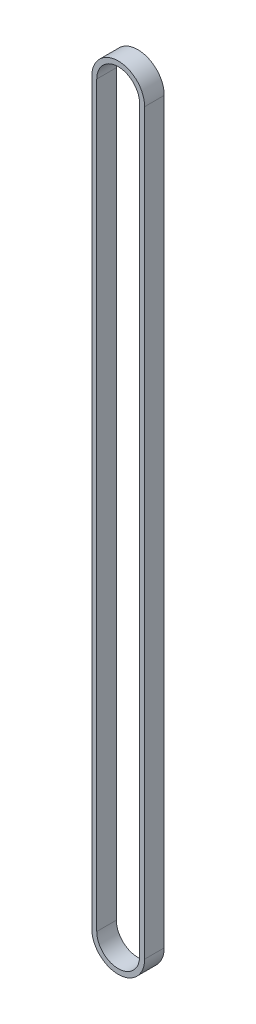
ISO-10303-21;
HEADER;
FILE_DESCRIPTION(('STEP AP214'),'2;1');
FILE_NAME('part.step','',(''),(''),'','','');
FILE_SCHEMA(('AUTOMOTIVE_DESIGN { 1 0 10303 214 1 1 1 1 }'));
ENDSEC;
DATA;
#1=APPLICATION_CONTEXT('core data for automotive mechanical design processes');
#2=APPLICATION_PROTOCOL_DEFINITION('international standard','automotive_design',2000,#1);
#3=PRODUCT_CONTEXT('',#1,'mechanical');
#4=PRODUCT('Part','Part','',(#3));
#5=PRODUCT_RELATED_PRODUCT_CATEGORY('part','',(#4));
#6=PRODUCT_DEFINITION_FORMATION('','',#4);
#7=PRODUCT_DEFINITION_CONTEXT('part definition',#1,'design');
#8=PRODUCT_DEFINITION('design','',#6,#7);
#9=PRODUCT_DEFINITION_SHAPE('','',#8);
#10=(LENGTH_UNIT() NAMED_UNIT(*) SI_UNIT(.MILLI.,.METRE.));
#11=(NAMED_UNIT(*) PLANE_ANGLE_UNIT() SI_UNIT($,.RADIAN.));
#12=(NAMED_UNIT(*) SI_UNIT($,.STERADIAN.) SOLID_ANGLE_UNIT());
#13=UNCERTAINTY_MEASURE_WITH_UNIT(LENGTH_MEASURE(1.E-05),#10,'distance_accuracy_value','');
#14=(GEOMETRIC_REPRESENTATION_CONTEXT(3) GLOBAL_UNCERTAINTY_ASSIGNED_CONTEXT((#13)) GLOBAL_UNIT_ASSIGNED_CONTEXT((#10,
#11,#12)) REPRESENTATION_CONTEXT('',''));
#15=CARTESIAN_POINT('',(0.,0.,0.));
#16=DIRECTION('',(0.,0.,1.));
#17=DIRECTION('',(1.,0.,0.));
#18=AXIS2_PLACEMENT_3D('',#15,#16,#17);
#19=CARTESIAN_POINT('',(-173.447800000006,0.,-228.050000000002));
#20=DIRECTION('',(1.,0.,0.));
#21=DIRECTION('',(0.,0.,-1.));
#22=AXIS2_PLACEMENT_3D('',#19,#20,#21);
#23=PLANE('',#22);
#24=DIRECTION('',(0.,1.,0.));
#25=VECTOR('',#24,1.);
#26=CARTESIAN_POINT('',(-173.447800000006,0.,-213.050000000002));
#27=LINE('',#26,#25);
#28=CARTESIAN_POINT('',(-173.447800000006,78.3000000000061,-213.050000000002));
#29=VERTEX_POINT('',#28);
#30=CARTESIAN_POINT('',(-173.447800000006,643.313999882004,-213.050000000002));
#31=VERTEX_POINT('',#30);
#32=EDGE_CURVE('E166',#29,#31,#27,.T.);
#33=ORIENTED_EDGE('',*,*,#32,.F.);
#34=DIRECTION('',(0.,0.,1.));
#35=VECTOR('',#34,1.);
#36=CARTESIAN_POINT('',(-173.447800000006,78.3000000000061,-228.050000000002));
#37=LINE('',#36,#35);
#38=CARTESIAN_POINT('',(-173.447800000006,78.3000000000061,-228.050000000002));
#39=VERTEX_POINT('',#38);
#40=EDGE_CURVE('E11',#39,#29,#37,.T.);
#41=ORIENTED_EDGE('',*,*,#40,.F.);
#42=DIRECTION('',(0.,1.,0.));
#43=VECTOR('',#42,1.);
#44=CARTESIAN_POINT('',(-173.447800000006,0.,-228.050000000002));
#45=LINE('',#44,#43);
#46=CARTESIAN_POINT('',(-173.447800000006,643.313999882004,-228.050000000002));
#47=VERTEX_POINT('',#46);
#48=EDGE_CURVE('E128',#39,#47,#45,.T.);
#49=ORIENTED_EDGE('',*,*,#48,.T.);
#50=DIRECTION('',(0.,0.,1.));
#51=VECTOR('',#50,1.);
#52=CARTESIAN_POINT('',(-173.447800000006,643.313999882004,-228.050000000002));
#53=LINE('',#52,#51);
#54=EDGE_CURVE('E93',#47,#31,#53,.T.);
#55=ORIENTED_EDGE('',*,*,#54,.T.);
#56=EDGE_LOOP('',(#33,#41,#49,#55));
#57=FACE_BOUND('',#56,.T.);
#58=ADVANCED_FACE('F39',(#57),#23,.T.);
#59=CARTESIAN_POINT('',(-193.675000000006,78.3000000000061,-228.050000000002));
#60=DIRECTION('',(0.,0.,1.));
#61=DIRECTION('',(1.,0.,0.));
#62=AXIS2_PLACEMENT_3D('',#59,#60,#61);
#63=CYLINDRICAL_SURFACE('',#62,20.2272);
#64=CARTESIAN_POINT('',(-193.675000000006,78.3000000000061,-213.050000000002));
#65=DIRECTION('',(0.,0.,-1.));
#66=DIRECTION('',(-1.,0.,0.));
#67=AXIS2_PLACEMENT_3D('',#64,#65,#66);
#68=CIRCLE('',#67,20.2272);
#69=CARTESIAN_POINT('',(-213.902200000006,78.3000000000061,-213.050000000002));
#70=VERTEX_POINT('',#69);
#71=EDGE_CURVE('E134',#29,#70,#68,.T.);
#72=ORIENTED_EDGE('',*,*,#71,.T.);
#73=DIRECTION('',(0.,0.,1.));
#74=VECTOR('',#73,1.);
#75=CARTESIAN_POINT('',(-213.902200000006,78.3000000000061,-228.050000000002));
#76=LINE('',#75,#74);
#77=CARTESIAN_POINT('',(-213.902200000006,78.3000000000061,-228.050000000002));
#78=VERTEX_POINT('',#77);
#79=EDGE_CURVE('E50',#78,#70,#76,.T.);
#80=ORIENTED_EDGE('',*,*,#79,.F.);
#81=CARTESIAN_POINT('',(-193.675000000006,78.3000000000061,-228.050000000002));
#82=DIRECTION('',(0.,0.,-1.));
#83=DIRECTION('',(-1.,0.,0.));
#84=AXIS2_PLACEMENT_3D('',#81,#82,#83);
#85=CIRCLE('',#84,20.2272);
#86=EDGE_CURVE('E124',#39,#78,#85,.T.);
#87=ORIENTED_EDGE('',*,*,#86,.F.);
#88=ORIENTED_EDGE('',*,*,#40,.T.);
#89=EDGE_LOOP('',(#72,#80,#87,#88));
#90=FACE_BOUND('',#89,.T.);
#91=ADVANCED_FACE('F132',(#90),#63,.T.);
#92=CARTESIAN_POINT('',(-213.902200000006,0.,-228.050000000002));
#93=DIRECTION('',(1.,0.,0.));
#94=DIRECTION('',(0.,0.,-1.));
#95=AXIS2_PLACEMENT_3D('',#92,#93,#94);
#96=PLANE('',#95);
#97=DIRECTION('',(0.,1.,0.));
#98=VECTOR('',#97,1.);
#99=CARTESIAN_POINT('',(-213.902200000006,0.,-213.050000000002));
#100=LINE('',#99,#98);
#101=CARTESIAN_POINT('',(-213.902200000006,643.313999882004,-213.050000000002));
#102=VERTEX_POINT('',#101);
#103=EDGE_CURVE('E161',#70,#102,#100,.T.);
#104=ORIENTED_EDGE('',*,*,#103,.T.);
#105=DIRECTION('',(0.,0.,1.));
#106=VECTOR('',#105,1.);
#107=CARTESIAN_POINT('',(-213.902200000006,643.313999882004,-228.050000000002));
#108=LINE('',#107,#106);
#109=CARTESIAN_POINT('',(-213.902200000006,643.313999882004,-228.050000000002));
#110=VERTEX_POINT('',#109);
#111=EDGE_CURVE('E122',#110,#102,#108,.T.);
#112=ORIENTED_EDGE('',*,*,#111,.F.);
#113=DIRECTION('',(0.,1.,0.));
#114=VECTOR('',#113,1.);
#115=CARTESIAN_POINT('',(-213.902200000006,0.,-228.050000000002));
#116=LINE('',#115,#114);
#117=EDGE_CURVE('E116',#78,#110,#116,.T.);
#118=ORIENTED_EDGE('',*,*,#117,.F.);
#119=ORIENTED_EDGE('',*,*,#79,.T.);
#120=EDGE_LOOP('',(#104,#112,#118,#119));
#121=FACE_BOUND('',#120,.T.);
#122=ADVANCED_FACE('F119',(#121),#96,.F.);
#123=CARTESIAN_POINT('',(-193.675000000006,78.3000000000061,-228.050000000002));
#124=DIRECTION('',(0.,0.,1.));
#125=DIRECTION('',(1.,0.,0.));
#126=AXIS2_PLACEMENT_3D('',#123,#124,#125);
#127=CYLINDRICAL_SURFACE('',#126,16.4172);
#128=CARTESIAN_POINT('',(-193.675000000006,78.3000000000061,-213.050000000002));
#129=DIRECTION('',(0.,0.,-1.));
#130=DIRECTION('',(-1.,0.,0.));
#131=AXIS2_PLACEMENT_3D('',#128,#129,#130);
#132=CIRCLE('',#131,16.4172);
#133=CARTESIAN_POINT('',(-177.257800000006,78.3000000000061,-213.050000000002));
#134=VERTEX_POINT('',#133);
#135=CARTESIAN_POINT('',(-210.092200000006,78.3000000000061,-213.050000000002));
#136=VERTEX_POINT('',#135);
#137=EDGE_CURVE('E180',#134,#136,#132,.T.);
#138=ORIENTED_EDGE('',*,*,#137,.F.);
#139=DIRECTION('',(0.,0.,1.));
#140=VECTOR('',#139,1.);
#141=CARTESIAN_POINT('',(-177.257800000006,78.3000000000061,-228.050000000002));
#142=LINE('',#141,#140);
#143=CARTESIAN_POINT('',(-177.257800000006,78.3000000000061,-228.050000000002));
#144=VERTEX_POINT('',#143);
#145=EDGE_CURVE('E43',#144,#134,#142,.T.);
#146=ORIENTED_EDGE('',*,*,#145,.F.);
#147=CARTESIAN_POINT('',(-193.675000000006,78.3000000000061,-228.050000000002));
#148=DIRECTION('',(0.,0.,-1.));
#149=DIRECTION('',(-1.,0.,0.));
#150=AXIS2_PLACEMENT_3D('',#147,#148,#149);
#151=CIRCLE('',#150,16.4172);
#152=CARTESIAN_POINT('',(-210.092200000006,78.3000000000061,-228.050000000002));
#153=VERTEX_POINT('',#152);
#154=EDGE_CURVE('E160',#144,#153,#151,.T.);
#155=ORIENTED_EDGE('',*,*,#154,.T.);
#156=DIRECTION('',(0.,0.,1.));
#157=VECTOR('',#156,1.);
#158=CARTESIAN_POINT('',(-210.092200000006,78.3000000000061,-228.050000000002));
#159=LINE('',#158,#157);
#160=EDGE_CURVE('E141',#153,#136,#159,.T.);
#161=ORIENTED_EDGE('',*,*,#160,.T.);
#162=EDGE_LOOP('',(#138,#146,#155,#161));
#163=FACE_BOUND('',#162,.T.);
#164=ADVANCED_FACE('F41',(#163),#127,.F.);
#165=CARTESIAN_POINT('',(-177.257800000006,0.,-228.050000000002));
#166=DIRECTION('',(1.,0.,0.));
#167=DIRECTION('',(0.,0.,-1.));
#168=AXIS2_PLACEMENT_3D('',#165,#166,#167);
#169=PLANE('',#168);
#170=DIRECTION('',(0.,1.,0.));
#171=VECTOR('',#170,1.);
#172=CARTESIAN_POINT('',(-177.257800000006,0.,-213.050000000002));
#173=LINE('',#172,#171);
#174=CARTESIAN_POINT('',(-177.257800000006,643.313999882004,-213.050000000002));
#175=VERTEX_POINT('',#174);
#176=EDGE_CURVE('E177',#134,#175,#173,.T.);
#177=ORIENTED_EDGE('',*,*,#176,.T.);
#178=DIRECTION('',(0.,0.,1.));
#179=VECTOR('',#178,1.);
#180=CARTESIAN_POINT('',(-177.257800000006,643.313999882004,-228.050000000002));
#181=LINE('',#180,#179);
#182=CARTESIAN_POINT('',(-177.257800000006,643.313999882004,-228.050000000002));
#183=VERTEX_POINT('',#182);
#184=EDGE_CURVE('E146',#183,#175,#181,.T.);
#185=ORIENTED_EDGE('',*,*,#184,.F.);
#186=DIRECTION('',(0.,1.,0.));
#187=VECTOR('',#186,1.);
#188=CARTESIAN_POINT('',(-177.257800000006,0.,-228.050000000002));
#189=LINE('',#188,#187);
#190=EDGE_CURVE('E195',#144,#183,#189,.T.);
#191=ORIENTED_EDGE('',*,*,#190,.F.);
#192=ORIENTED_EDGE('',*,*,#145,.T.);
#193=EDGE_LOOP('',(#177,#185,#191,#192));
#194=FACE_BOUND('',#193,.T.);
#195=ADVANCED_FACE('F208',(#194),#169,.F.);
#196=CARTESIAN_POINT('',(-193.675000000006,643.313999882004,-228.050000000002));
#197=DIRECTION('',(0.,0.,1.));
#198=DIRECTION('',(1.,0.,0.));
#199=AXIS2_PLACEMENT_3D('',#196,#197,#198);
#200=CYLINDRICAL_SURFACE('',#199,16.4172);
#201=CARTESIAN_POINT('',(-193.675000000006,643.313999882004,-213.050000000002));
#202=DIRECTION('',(0.,0.,-1.));
#203=DIRECTION('',(-1.,0.,0.));
#204=AXIS2_PLACEMENT_3D('',#201,#202,#203);
#205=CIRCLE('',#204,16.4172);
#206=CARTESIAN_POINT('',(-210.092200000006,643.313999882004,-213.050000000002));
#207=VERTEX_POINT('',#206);
#208=EDGE_CURVE('E173',#207,#175,#205,.T.);
#209=ORIENTED_EDGE('',*,*,#208,.F.);
#210=DIRECTION('',(0.,0.,1.));
#211=VECTOR('',#210,1.);
#212=CARTESIAN_POINT('',(-210.092200000006,643.313999882004,-228.050000000002));
#213=LINE('',#212,#211);
#214=CARTESIAN_POINT('',(-210.092200000006,643.313999882004,-228.050000000002));
#215=VERTEX_POINT('',#214);
#216=EDGE_CURVE('E144',#215,#207,#213,.T.);
#217=ORIENTED_EDGE('',*,*,#216,.F.);
#218=CARTESIAN_POINT('',(-193.675000000006,643.313999882004,-228.050000000002));
#219=DIRECTION('',(0.,0.,-1.));
#220=DIRECTION('',(-1.,0.,0.));
#221=AXIS2_PLACEMENT_3D('',#218,#219,#220);
#222=CIRCLE('',#221,16.4172);
#223=EDGE_CURVE('E192',#215,#183,#222,.T.);
#224=ORIENTED_EDGE('',*,*,#223,.T.);
#225=ORIENTED_EDGE('',*,*,#184,.T.);
#226=EDGE_LOOP('',(#209,#217,#224,#225));
#227=FACE_BOUND('',#226,.T.);
#228=ADVANCED_FACE('F209',(#227),#200,.F.);
#229=CARTESIAN_POINT('',(-210.092200000006,0.,-228.050000000002));
#230=DIRECTION('',(1.,0.,0.));
#231=DIRECTION('',(0.,0.,-1.));
#232=AXIS2_PLACEMENT_3D('',#229,#230,#231);
#233=PLANE('',#232);
#234=DIRECTION('',(0.,1.,0.));
#235=VECTOR('',#234,1.);
#236=CARTESIAN_POINT('',(-210.092200000006,0.,-213.050000000002));
#237=LINE('',#236,#235);
#238=EDGE_CURVE('E169',#136,#207,#237,.T.);
#239=ORIENTED_EDGE('',*,*,#238,.F.);
#240=ORIENTED_EDGE('',*,*,#160,.F.);
#241=DIRECTION('',(0.,1.,0.));
#242=VECTOR('',#241,1.);
#243=CARTESIAN_POINT('',(-210.092200000006,0.,-228.050000000002));
#244=LINE('',#243,#242);
#245=EDGE_CURVE('E188',#153,#215,#244,.T.);
#246=ORIENTED_EDGE('',*,*,#245,.T.);
#247=ORIENTED_EDGE('',*,*,#216,.T.);
#248=EDGE_LOOP('',(#239,#240,#246,#247));
#249=FACE_BOUND('',#248,.T.);
#250=ADVANCED_FACE('F205',(#249),#233,.T.);
#251=CARTESIAN_POINT('',(-193.675000000006,643.313999882004,-228.050000000002));
#252=DIRECTION('',(0.,0.,1.));
#253=DIRECTION('',(1.,0.,0.));
#254=AXIS2_PLACEMENT_3D('',#251,#252,#253);
#255=CYLINDRICAL_SURFACE('',#254,20.2272);
#256=CARTESIAN_POINT('',(-193.675000000006,643.313999882004,-213.050000000002));
#257=DIRECTION('',(0.,0.,-1.));
#258=DIRECTION('',(-1.,0.,0.));
#259=AXIS2_PLACEMENT_3D('',#256,#257,#258);
#260=CIRCLE('',#259,20.2272);
#261=EDGE_CURVE('E86',#102,#31,#260,.T.);
#262=ORIENTED_EDGE('',*,*,#261,.T.);
#263=ORIENTED_EDGE('',*,*,#54,.F.);
#264=CARTESIAN_POINT('',(-193.675000000006,643.313999882004,-228.050000000002));
#265=DIRECTION('',(0.,0.,-1.));
#266=DIRECTION('',(-1.,0.,0.));
#267=AXIS2_PLACEMENT_3D('',#264,#265,#266);
#268=CIRCLE('',#267,20.2272);
#269=EDGE_CURVE('E59',#110,#47,#268,.T.);
#270=ORIENTED_EDGE('',*,*,#269,.F.);
#271=ORIENTED_EDGE('',*,*,#111,.T.);
#272=EDGE_LOOP('',(#262,#263,#270,#271));
#273=FACE_BOUND('',#272,.T.);
#274=ADVANCED_FACE('F216',(#273),#255,.T.);
#275=CARTESIAN_POINT('',(0.,0.,-228.050000000002));
#276=DIRECTION('',(0.,0.,-1.));
#277=DIRECTION('',(-1.,0.,0.));
#278=AXIS2_PLACEMENT_3D('',#275,#276,#277);
#279=PLANE('',#278);
#280=ORIENTED_EDGE('',*,*,#154,.F.);
#281=ORIENTED_EDGE('',*,*,#190,.T.);
#282=ORIENTED_EDGE('',*,*,#223,.F.);
#283=ORIENTED_EDGE('',*,*,#245,.F.);
#284=EDGE_LOOP('',(#280,#281,#282,#283));
#285=FACE_BOUND('',#284,.T.);
#286=ORIENTED_EDGE('',*,*,#48,.F.);
#287=ORIENTED_EDGE('',*,*,#86,.T.);
#288=ORIENTED_EDGE('',*,*,#117,.T.);
#289=ORIENTED_EDGE('',*,*,#269,.T.);
#290=EDGE_LOOP('',(#286,#287,#288,#289));
#291=FACE_BOUND('',#290,.T.);
#292=ADVANCED_FACE('F127',(#285,#291),#279,.T.);
#293=CARTESIAN_POINT('',(0.,0.,-213.050000000002));
#294=DIRECTION('',(0.,0.,-1.));
#295=DIRECTION('',(-1.,0.,0.));
#296=AXIS2_PLACEMENT_3D('',#293,#294,#295);
#297=PLANE('',#296);
#298=ORIENTED_EDGE('',*,*,#137,.T.);
#299=ORIENTED_EDGE('',*,*,#238,.T.);
#300=ORIENTED_EDGE('',*,*,#208,.T.);
#301=ORIENTED_EDGE('',*,*,#176,.F.);
#302=EDGE_LOOP('',(#298,#299,#300,#301));
#303=FACE_BOUND('',#302,.T.);
#304=ORIENTED_EDGE('',*,*,#32,.T.);
#305=ORIENTED_EDGE('',*,*,#261,.F.);
#306=ORIENTED_EDGE('',*,*,#103,.F.);
#307=ORIENTED_EDGE('',*,*,#71,.F.);
#308=EDGE_LOOP('',(#304,#305,#306,#307));
#309=FACE_BOUND('',#308,.T.);
#310=ADVANCED_FACE('F207',(#303,#309),#297,.F.);
#311=CLOSED_SHELL('',(#58,#91,#122,#164,#195,#228,#250,#274,#292,#310));
#312=MANIFOLD_SOLID_BREP('B2',#311);
#313=ADVANCED_BREP_SHAPE_REPRESENTATION('',(#18,#312),#14);
#314=SHAPE_DEFINITION_REPRESENTATION(#9,#313);
ENDSEC;
END-ISO-10303-21;
